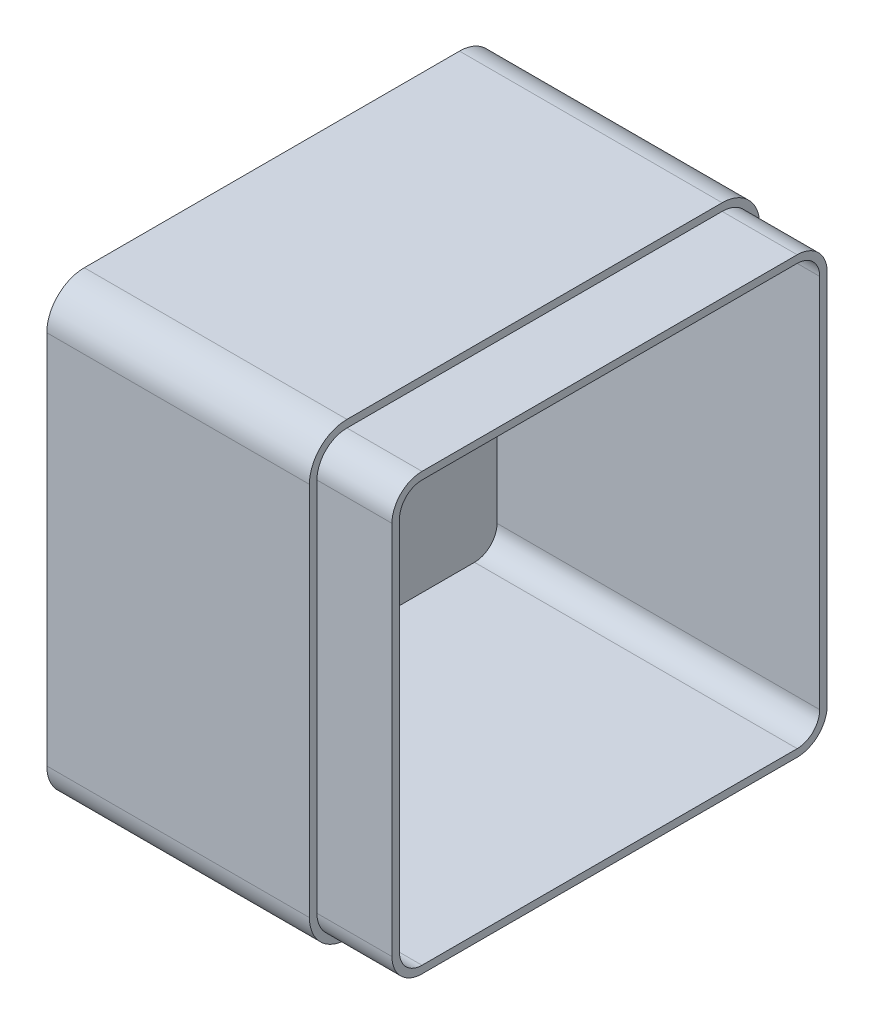
ISO-10303-21;
HEADER;
FILE_DESCRIPTION(('STEP AP214'),'2;1');
FILE_NAME('part.step','',(''),(''),'','','');
FILE_SCHEMA(('AUTOMOTIVE_DESIGN { 1 0 10303 214 1 1 1 1 }'));
ENDSEC;
DATA;
#1=APPLICATION_CONTEXT('core data for automotive mechanical design processes');
#2=APPLICATION_PROTOCOL_DEFINITION('international standard','automotive_design',2000,#1);
#3=PRODUCT_CONTEXT('',#1,'mechanical');
#4=PRODUCT('Part','Part','',(#3));
#5=PRODUCT_RELATED_PRODUCT_CATEGORY('part','',(#4));
#6=PRODUCT_DEFINITION_FORMATION('','',#4);
#7=PRODUCT_DEFINITION_CONTEXT('part definition',#1,'design');
#8=PRODUCT_DEFINITION('design','',#6,#7);
#9=PRODUCT_DEFINITION_SHAPE('','',#8);
#10=(LENGTH_UNIT() NAMED_UNIT(*) SI_UNIT(.MILLI.,.METRE.));
#11=(NAMED_UNIT(*) PLANE_ANGLE_UNIT() SI_UNIT($,.RADIAN.));
#12=(NAMED_UNIT(*) SI_UNIT($,.STERADIAN.) SOLID_ANGLE_UNIT());
#13=UNCERTAINTY_MEASURE_WITH_UNIT(LENGTH_MEASURE(1.E-05),#10,'distance_accuracy_value','');
#14=(GEOMETRIC_REPRESENTATION_CONTEXT(3) GLOBAL_UNCERTAINTY_ASSIGNED_CONTEXT((#13)) GLOBAL_UNIT_ASSIGNED_CONTEXT((#10,
#11,#12)) REPRESENTATION_CONTEXT('',''));
#15=CARTESIAN_POINT('',(0.,0.,0.));
#16=DIRECTION('',(0.,0.,1.));
#17=DIRECTION('',(1.,0.,0.));
#18=AXIS2_PLACEMENT_3D('',#15,#16,#17);
#19=CARTESIAN_POINT('',(90.,0.,0.));
#20=DIRECTION('',(-1.,0.,0.));
#21=DIRECTION('',(0.,0.,1.));
#22=AXIS2_PLACEMENT_3D('',#19,#20,#21);
#23=PLANE('',#22);
#24=DIRECTION('',(0.,1.,0.));
#25=VECTOR('',#24,1.);
#26=CARTESIAN_POINT('',(90.,0.,4.));
#27=LINE('',#26,#25);
#28=CARTESIAN_POINT('',(90.,9.99999999999999,4.));
#29=VERTEX_POINT('',#28);
#30=CARTESIAN_POINT('',(90.,110.,4.));
#31=VERTEX_POINT('',#30);
#32=EDGE_CURVE('E345',#29,#31,#27,.T.);
#33=ORIENTED_EDGE('',*,*,#32,.F.);
#34=CARTESIAN_POINT('',(90.,9.99999999999999,10.));
#35=DIRECTION('',(-1.,0.,0.));
#36=DIRECTION('',(0.,0.,1.));
#37=AXIS2_PLACEMENT_3D('',#34,#35,#36);
#38=CIRCLE('',#37,6.);
#39=CARTESIAN_POINT('',(90.,4.,10.));
#40=VERTEX_POINT('',#39);
#41=EDGE_CURVE('E346',#40,#29,#38,.F.);
#42=ORIENTED_EDGE('',*,*,#41,.F.);
#43=DIRECTION('',(0.,0.,-1.));
#44=VECTOR('',#43,1.);
#45=CARTESIAN_POINT('',(90.,4.,0.));
#46=LINE('',#45,#44);
#47=CARTESIAN_POINT('',(90.,3.99999999999996,110.));
#48=VERTEX_POINT('',#47);
#49=EDGE_CURVE('E326',#48,#40,#46,.T.);
#50=ORIENTED_EDGE('',*,*,#49,.F.);
#51=CARTESIAN_POINT('',(90.,9.99999999999996,110.));
#52=DIRECTION('',(-1.,0.,0.));
#53=DIRECTION('',(0.,0.,1.));
#54=AXIS2_PLACEMENT_3D('',#51,#52,#53);
#55=CIRCLE('',#54,6.);
#56=CARTESIAN_POINT('',(90.,9.99999999999996,116.));
#57=VERTEX_POINT('',#56);
#58=EDGE_CURVE('E348',#57,#48,#55,.F.);
#59=ORIENTED_EDGE('',*,*,#58,.F.);
#60=DIRECTION('',(0.,-1.,0.));
#61=VECTOR('',#60,1.);
#62=CARTESIAN_POINT('',(90.,0.,116.));
#63=LINE('',#62,#61);
#64=CARTESIAN_POINT('',(90.,110.,116.));
#65=VERTEX_POINT('',#64);
#66=EDGE_CURVE('E338',#65,#57,#63,.T.);
#67=ORIENTED_EDGE('',*,*,#66,.F.);
#68=CARTESIAN_POINT('',(90.,110.,110.));
#69=DIRECTION('',(-1.,0.,0.));
#70=DIRECTION('',(0.,0.,1.));
#71=AXIS2_PLACEMENT_3D('',#68,#69,#70);
#72=CIRCLE('',#71,6.);
#73=CARTESIAN_POINT('',(90.,116.,110.));
#74=VERTEX_POINT('',#73);
#75=EDGE_CURVE('E331',#74,#65,#72,.F.);
#76=ORIENTED_EDGE('',*,*,#75,.F.);
#77=DIRECTION('',(0.,0.,1.));
#78=VECTOR('',#77,1.);
#79=CARTESIAN_POINT('',(90.,116.,0.));
#80=LINE('',#79,#78);
#81=CARTESIAN_POINT('',(90.,116.,10.));
#82=VERTEX_POINT('',#81);
#83=EDGE_CURVE('E351',#82,#74,#80,.T.);
#84=ORIENTED_EDGE('',*,*,#83,.F.);
#85=CARTESIAN_POINT('',(90.,110.,10.));
#86=DIRECTION('',(-1.,0.,0.));
#87=DIRECTION('',(0.,0.,1.));
#88=AXIS2_PLACEMENT_3D('',#85,#86,#87);
#89=CIRCLE('',#88,6.);
#90=EDGE_CURVE('E309',#31,#82,#89,.F.);
#91=ORIENTED_EDGE('',*,*,#90,.F.);
#92=EDGE_LOOP('',(#33,#42,#50,#59,#67,#76,#84,#91));
#93=FACE_BOUND('',#92,.T.);
#94=CARTESIAN_POINT('',(90.,9.99999999999999,10.));
#95=DIRECTION('',(1.,0.,0.));
#96=DIRECTION('',(0.,0.,-1.));
#97=AXIS2_PLACEMENT_3D('',#94,#95,#96);
#98=CIRCLE('',#97,8.00000000000001);
#99=CARTESIAN_POINT('',(90.,1.99999999999996,9.99999999999999));
#100=VERTEX_POINT('',#99);
#101=CARTESIAN_POINT('',(90.,9.99999999999999,2.));
#102=VERTEX_POINT('',#101);
#103=EDGE_CURVE('E256',#100,#102,#98,.T.);
#104=ORIENTED_EDGE('',*,*,#103,.T.);
#105=DIRECTION('',(0.,1.,0.));
#106=VECTOR('',#105,1.);
#107=CARTESIAN_POINT('',(90.,9.99999999999999,2.));
#108=LINE('',#107,#106);
#109=CARTESIAN_POINT('',(90.,110.,2.));
#110=VERTEX_POINT('',#109);
#111=EDGE_CURVE('E216',#102,#110,#108,.T.);
#112=ORIENTED_EDGE('',*,*,#111,.T.);
#113=CARTESIAN_POINT('',(90.,110.,10.));
#114=DIRECTION('',(1.,0.,0.));
#115=DIRECTION('',(0.,0.,-1.));
#116=AXIS2_PLACEMENT_3D('',#113,#114,#115);
#117=CIRCLE('',#116,7.99999999999999);
#118=CARTESIAN_POINT('',(90.,118.,9.99999999999999));
#119=VERTEX_POINT('',#118);
#120=EDGE_CURVE('E64',#110,#119,#117,.T.);
#121=ORIENTED_EDGE('',*,*,#120,.T.);
#122=DIRECTION('',(0.,0.,1.));
#123=VECTOR('',#122,1.);
#124=CARTESIAN_POINT('',(90.,118.,9.99999999999999));
#125=LINE('',#124,#123);
#126=CARTESIAN_POINT('',(90.,118.,110.));
#127=VERTEX_POINT('',#126);
#128=EDGE_CURVE('E260',#119,#127,#125,.T.);
#129=ORIENTED_EDGE('',*,*,#128,.T.);
#130=CARTESIAN_POINT('',(90.,110.,110.));
#131=DIRECTION('',(1.,0.,0.));
#132=DIRECTION('',(0.,0.,-1.));
#133=AXIS2_PLACEMENT_3D('',#130,#131,#132);
#134=CIRCLE('',#133,8.00000000000001);
#135=CARTESIAN_POINT('',(90.,110.,118.));
#136=VERTEX_POINT('',#135);
#137=EDGE_CURVE('E263',#127,#136,#134,.T.);
#138=ORIENTED_EDGE('',*,*,#137,.T.);
#139=DIRECTION('',(0.,-1.,0.));
#140=VECTOR('',#139,1.);
#141=CARTESIAN_POINT('',(90.,110.,118.));
#142=LINE('',#141,#140);
#143=CARTESIAN_POINT('',(90.,9.99999999999995,118.));
#144=VERTEX_POINT('',#143);
#145=EDGE_CURVE('E266',#136,#144,#142,.T.);
#146=ORIENTED_EDGE('',*,*,#145,.T.);
#147=CARTESIAN_POINT('',(90.,9.99999999999996,110.));
#148=DIRECTION('',(1.,0.,0.));
#149=DIRECTION('',(0.,0.,-1.));
#150=AXIS2_PLACEMENT_3D('',#147,#148,#149);
#151=CIRCLE('',#150,7.99999999999999);
#152=CARTESIAN_POINT('',(90.,1.99999999999997,110.));
#153=VERTEX_POINT('',#152);
#154=EDGE_CURVE('E239',#144,#153,#151,.T.);
#155=ORIENTED_EDGE('',*,*,#154,.T.);
#156=DIRECTION('',(0.,0.,-1.));
#157=VECTOR('',#156,1.);
#158=CARTESIAN_POINT('',(90.,1.99999999999996,110.));
#159=LINE('',#158,#157);
#160=EDGE_CURVE('E236',#153,#100,#159,.T.);
#161=ORIENTED_EDGE('',*,*,#160,.T.);
#162=EDGE_LOOP('',(#104,#112,#121,#129,#138,#146,#155,#161));
#163=FACE_BOUND('',#162,.T.);
#164=ADVANCED_FACE('F49',(#93,#163),#23,.F.);
#165=CARTESIAN_POINT('',(90.,4.,0.));
#166=DIRECTION('',(0.,1.,0.));
#167=DIRECTION('',(0.,0.,1.));
#168=AXIS2_PLACEMENT_3D('',#165,#166,#167);
#169=PLANE('',#168);
#170=DIRECTION('',(0.,0.,-1.));
#171=VECTOR('',#170,1.);
#172=CARTESIAN_POINT('',(4.,4.,0.));
#173=LINE('',#172,#171);
#174=CARTESIAN_POINT('',(4.,3.99999999999996,110.));
#175=VERTEX_POINT('',#174);
#176=CARTESIAN_POINT('',(4.,4.,10.));
#177=VERTEX_POINT('',#176);
#178=EDGE_CURVE('E298',#175,#177,#173,.T.);
#179=ORIENTED_EDGE('',*,*,#178,.F.);
#180=DIRECTION('',(1.,0.,0.));
#181=VECTOR('',#180,1.);
#182=CARTESIAN_POINT('',(90.,3.99999999999996,110.));
#183=LINE('',#182,#181);
#184=EDGE_CURVE('E306',#48,#175,#183,.F.);
#185=ORIENTED_EDGE('',*,*,#184,.F.);
#186=ORIENTED_EDGE('',*,*,#49,.T.);
#187=DIRECTION('',(1.,0.,0.));
#188=VECTOR('',#187,1.);
#189=CARTESIAN_POINT('',(90.,4.,10.));
#190=LINE('',#189,#188);
#191=EDGE_CURVE('E302',#177,#40,#190,.T.);
#192=ORIENTED_EDGE('',*,*,#191,.F.);
#193=EDGE_LOOP('',(#179,#185,#186,#192));
#194=FACE_BOUND('',#193,.T.);
#195=ADVANCED_FACE('F442',(#194),#169,.T.);
#196=CARTESIAN_POINT('',(90.,0.,4.));
#197=DIRECTION('',(0.,0.,1.));
#198=DIRECTION('',(1.,0.,0.));
#199=AXIS2_PLACEMENT_3D('',#196,#197,#198);
#200=PLANE('',#199);
#201=DIRECTION('',(0.,1.,0.));
#202=VECTOR('',#201,1.);
#203=CARTESIAN_POINT('',(4.,0.,4.));
#204=LINE('',#203,#202);
#205=CARTESIAN_POINT('',(4.,9.99999999999999,4.));
#206=VERTEX_POINT('',#205);
#207=CARTESIAN_POINT('',(4.,110.,4.));
#208=VERTEX_POINT('',#207);
#209=EDGE_CURVE('E301',#206,#208,#204,.T.);
#210=ORIENTED_EDGE('',*,*,#209,.F.);
#211=DIRECTION('',(1.,0.,0.));
#212=VECTOR('',#211,1.);
#213=CARTESIAN_POINT('',(90.,9.99999999999999,4.));
#214=LINE('',#213,#212);
#215=EDGE_CURVE('E316',#29,#206,#214,.F.);
#216=ORIENTED_EDGE('',*,*,#215,.F.);
#217=ORIENTED_EDGE('',*,*,#32,.T.);
#218=DIRECTION('',(1.,0.,0.));
#219=VECTOR('',#218,1.);
#220=CARTESIAN_POINT('',(90.,110.,4.));
#221=LINE('',#220,#219);
#222=EDGE_CURVE('E329',#208,#31,#221,.T.);
#223=ORIENTED_EDGE('',*,*,#222,.F.);
#224=EDGE_LOOP('',(#210,#216,#217,#223));
#225=FACE_BOUND('',#224,.T.);
#226=ADVANCED_FACE('F450',(#225),#200,.T.);
#227=CARTESIAN_POINT('',(90.,116.,0.));
#228=DIRECTION('',(0.,-1.,0.));
#229=DIRECTION('',(0.,0.,-1.));
#230=AXIS2_PLACEMENT_3D('',#227,#228,#229);
#231=PLANE('',#230);
#232=ORIENTED_EDGE('',*,*,#83,.T.);
#233=DIRECTION('',(1.,0.,0.));
#234=VECTOR('',#233,1.);
#235=CARTESIAN_POINT('',(90.,116.,110.));
#236=LINE('',#235,#234);
#237=CARTESIAN_POINT('',(4.,116.,110.));
#238=VERTEX_POINT('',#237);
#239=EDGE_CURVE('E336',#238,#74,#236,.T.);
#240=ORIENTED_EDGE('',*,*,#239,.F.);
#241=DIRECTION('',(0.,0.,1.));
#242=VECTOR('',#241,1.);
#243=CARTESIAN_POINT('',(4.,116.,0.));
#244=LINE('',#243,#242);
#245=CARTESIAN_POINT('',(4.,116.,10.));
#246=VERTEX_POINT('',#245);
#247=EDGE_CURVE('E310',#246,#238,#244,.T.);
#248=ORIENTED_EDGE('',*,*,#247,.F.);
#249=DIRECTION('',(1.,0.,0.));
#250=VECTOR('',#249,1.);
#251=CARTESIAN_POINT('',(90.,116.,10.));
#252=LINE('',#251,#250);
#253=EDGE_CURVE('E328',#82,#246,#252,.F.);
#254=ORIENTED_EDGE('',*,*,#253,.F.);
#255=EDGE_LOOP('',(#232,#240,#248,#254));
#256=FACE_BOUND('',#255,.T.);
#257=ADVANCED_FACE('F569',(#256),#231,.T.);
#258=CARTESIAN_POINT('',(90.,0.,116.));
#259=DIRECTION('',(0.,0.,-1.));
#260=DIRECTION('',(-1.,0.,0.));
#261=AXIS2_PLACEMENT_3D('',#258,#259,#260);
#262=PLANE('',#261);
#263=DIRECTION('',(0.,-1.,0.));
#264=VECTOR('',#263,1.);
#265=CARTESIAN_POINT('',(4.,0.,116.));
#266=LINE('',#265,#264);
#267=CARTESIAN_POINT('',(4.,110.,116.));
#268=VERTEX_POINT('',#267);
#269=CARTESIAN_POINT('',(4.,9.99999999999996,116.));
#270=VERTEX_POINT('',#269);
#271=EDGE_CURVE('E313',#268,#270,#266,.T.);
#272=ORIENTED_EDGE('',*,*,#271,.F.);
#273=DIRECTION('',(-1.,0.,0.));
#274=VECTOR('',#273,1.);
#275=CARTESIAN_POINT('',(90.,110.,116.));
#276=LINE('',#275,#274);
#277=EDGE_CURVE('E305',#65,#268,#276,.T.);
#278=ORIENTED_EDGE('',*,*,#277,.F.);
#279=ORIENTED_EDGE('',*,*,#66,.T.);
#280=DIRECTION('',(-1.,0.,0.));
#281=VECTOR('',#280,1.);
#282=CARTESIAN_POINT('',(90.,9.99999999999996,116.));
#283=LINE('',#282,#281);
#284=EDGE_CURVE('E341',#270,#57,#283,.F.);
#285=ORIENTED_EDGE('',*,*,#284,.F.);
#286=EDGE_LOOP('',(#272,#278,#279,#285));
#287=FACE_BOUND('',#286,.T.);
#288=ADVANCED_FACE('F573',(#287),#262,.T.);
#289=CARTESIAN_POINT('',(4.,0.,0.));
#290=DIRECTION('',(-1.,0.,0.));
#291=DIRECTION('',(0.,0.,1.));
#292=AXIS2_PLACEMENT_3D('',#289,#290,#291);
#293=PLANE('',#292);
#294=ORIENTED_EDGE('',*,*,#247,.T.);
#295=CARTESIAN_POINT('',(4.,110.,110.));
#296=DIRECTION('',(-1.,0.,0.));
#297=DIRECTION('',(0.,0.,1.));
#298=AXIS2_PLACEMENT_3D('',#295,#296,#297);
#299=CIRCLE('',#298,6.);
#300=EDGE_CURVE('E323',#268,#238,#299,.T.);
#301=ORIENTED_EDGE('',*,*,#300,.F.);
#302=ORIENTED_EDGE('',*,*,#271,.T.);
#303=CARTESIAN_POINT('',(4.,9.99999999999996,110.));
#304=DIRECTION('',(-1.,0.,0.));
#305=DIRECTION('',(0.,0.,1.));
#306=AXIS2_PLACEMENT_3D('',#303,#304,#305);
#307=CIRCLE('',#306,6.);
#308=EDGE_CURVE('E321',#175,#270,#307,.T.);
#309=ORIENTED_EDGE('',*,*,#308,.F.);
#310=ORIENTED_EDGE('',*,*,#178,.T.);
#311=CARTESIAN_POINT('',(4.,9.99999999999999,10.));
#312=DIRECTION('',(-1.,0.,0.));
#313=DIRECTION('',(0.,0.,1.));
#314=AXIS2_PLACEMENT_3D('',#311,#312,#313);
#315=CIRCLE('',#314,6.);
#316=EDGE_CURVE('E317',#206,#177,#315,.T.);
#317=ORIENTED_EDGE('',*,*,#316,.F.);
#318=ORIENTED_EDGE('',*,*,#209,.T.);
#319=CARTESIAN_POINT('',(4.,110.,10.));
#320=DIRECTION('',(-1.,0.,0.));
#321=DIRECTION('',(0.,0.,1.));
#322=AXIS2_PLACEMENT_3D('',#319,#320,#321);
#323=CIRCLE('',#322,6.);
#324=EDGE_CURVE('E314',#246,#208,#323,.T.);
#325=ORIENTED_EDGE('',*,*,#324,.F.);
#326=EDGE_LOOP('',(#294,#301,#302,#309,#310,#317,#318,#325));
#327=FACE_BOUND('',#326,.T.);
#328=ADVANCED_FACE('F577',(#327),#293,.F.);
#329=CARTESIAN_POINT('',(90.,110.,10.));
#330=DIRECTION('',(-1.,0.,0.));
#331=DIRECTION('',(0.,0.,1.));
#332=AXIS2_PLACEMENT_3D('',#329,#330,#331);
#333=CYLINDRICAL_SURFACE('',#332,6.);
#334=ORIENTED_EDGE('',*,*,#90,.T.);
#335=ORIENTED_EDGE('',*,*,#253,.T.);
#336=ORIENTED_EDGE('',*,*,#324,.T.);
#337=ORIENTED_EDGE('',*,*,#222,.T.);
#338=EDGE_LOOP('',(#334,#335,#336,#337));
#339=FACE_BOUND('',#338,.T.);
#340=ADVANCED_FACE('F581',(#339),#333,.F.);
#341=CARTESIAN_POINT('',(90.,9.99999999999999,10.));
#342=DIRECTION('',(-1.,0.,0.));
#343=DIRECTION('',(0.,0.,1.));
#344=AXIS2_PLACEMENT_3D('',#341,#342,#343);
#345=CYLINDRICAL_SURFACE('',#344,6.);
#346=ORIENTED_EDGE('',*,*,#41,.T.);
#347=ORIENTED_EDGE('',*,*,#215,.T.);
#348=ORIENTED_EDGE('',*,*,#316,.T.);
#349=ORIENTED_EDGE('',*,*,#191,.T.);
#350=EDGE_LOOP('',(#346,#347,#348,#349));
#351=FACE_BOUND('',#350,.T.);
#352=ADVANCED_FACE('F585',(#351),#345,.F.);
#353=CARTESIAN_POINT('',(90.,9.99999999999996,110.));
#354=DIRECTION('',(-1.,0.,0.));
#355=DIRECTION('',(0.,0.,1.));
#356=AXIS2_PLACEMENT_3D('',#353,#354,#355);
#357=CYLINDRICAL_SURFACE('',#356,6.);
#358=ORIENTED_EDGE('',*,*,#58,.T.);
#359=ORIENTED_EDGE('',*,*,#184,.T.);
#360=ORIENTED_EDGE('',*,*,#308,.T.);
#361=ORIENTED_EDGE('',*,*,#284,.T.);
#362=EDGE_LOOP('',(#358,#359,#360,#361));
#363=FACE_BOUND('',#362,.T.);
#364=ADVANCED_FACE('F588',(#363),#357,.F.);
#365=CARTESIAN_POINT('',(90.,110.,110.));
#366=DIRECTION('',(-1.,0.,0.));
#367=DIRECTION('',(0.,0.,1.));
#368=AXIS2_PLACEMENT_3D('',#365,#366,#367);
#369=CYLINDRICAL_SURFACE('',#368,6.);
#370=ORIENTED_EDGE('',*,*,#75,.T.);
#371=ORIENTED_EDGE('',*,*,#277,.T.);
#372=ORIENTED_EDGE('',*,*,#300,.T.);
#373=ORIENTED_EDGE('',*,*,#239,.T.);
#374=EDGE_LOOP('',(#370,#371,#372,#373));
#375=FACE_BOUND('',#374,.T.);
#376=ADVANCED_FACE('F457',(#375),#369,.F.);
#377=CARTESIAN_POINT('',(70.,9.99999999999999,10.));
#378=DIRECTION('',(1.,0.,0.));
#379=DIRECTION('',(0.,0.,-1.));
#380=AXIS2_PLACEMENT_3D('',#377,#378,#379);
#381=PLANE('',#380);
#382=DIRECTION('',(0.,0.,-1.));
#383=VECTOR('',#382,1.);
#384=CARTESIAN_POINT('',(70.,1.99999999999996,110.));
#385=LINE('',#384,#383);
#386=CARTESIAN_POINT('',(70.,1.99999999999997,110.));
#387=VERTEX_POINT('',#386);
#388=CARTESIAN_POINT('',(70.,1.99999999999996,9.99999999999999));
#389=VERTEX_POINT('',#388);
#390=EDGE_CURVE('E222',#387,#389,#385,.T.);
#391=ORIENTED_EDGE('',*,*,#390,.F.);
#392=CARTESIAN_POINT('',(70.,9.99999999999996,110.));
#393=DIRECTION('',(1.,0.,0.));
#394=DIRECTION('',(0.,0.,-1.));
#395=AXIS2_PLACEMENT_3D('',#392,#393,#394);
#396=CIRCLE('',#395,7.99999999999999);
#397=CARTESIAN_POINT('',(70.,9.99999999999995,118.));
#398=VERTEX_POINT('',#397);
#399=EDGE_CURVE('E252',#398,#387,#396,.T.);
#400=ORIENTED_EDGE('',*,*,#399,.F.);
#401=DIRECTION('',(0.,-1.,0.));
#402=VECTOR('',#401,1.);
#403=CARTESIAN_POINT('',(70.,110.,118.));
#404=LINE('',#403,#402);
#405=CARTESIAN_POINT('',(70.,110.,118.));
#406=VERTEX_POINT('',#405);
#407=EDGE_CURVE('E249',#406,#398,#404,.T.);
#408=ORIENTED_EDGE('',*,*,#407,.F.);
#409=CARTESIAN_POINT('',(70.,110.,110.));
#410=DIRECTION('',(1.,0.,0.));
#411=DIRECTION('',(0.,0.,-1.));
#412=AXIS2_PLACEMENT_3D('',#409,#410,#411);
#413=CIRCLE('',#412,8.00000000000001);
#414=CARTESIAN_POINT('',(70.,118.,110.));
#415=VERTEX_POINT('',#414);
#416=EDGE_CURVE('E246',#415,#406,#413,.T.);
#417=ORIENTED_EDGE('',*,*,#416,.F.);
#418=DIRECTION('',(0.,0.,1.));
#419=VECTOR('',#418,1.);
#420=CARTESIAN_POINT('',(70.,118.,9.99999999999999));
#421=LINE('',#420,#419);
#422=CARTESIAN_POINT('',(70.,118.,9.99999999999999));
#423=VERTEX_POINT('',#422);
#424=EDGE_CURVE('E243',#423,#415,#421,.T.);
#425=ORIENTED_EDGE('',*,*,#424,.F.);
#426=CARTESIAN_POINT('',(70.,110.,10.));
#427=DIRECTION('',(1.,0.,0.));
#428=DIRECTION('',(0.,0.,-1.));
#429=AXIS2_PLACEMENT_3D('',#426,#427,#428);
#430=CIRCLE('',#429,7.99999999999999);
#431=CARTESIAN_POINT('',(70.,110.,2.));
#432=VERTEX_POINT('',#431);
#433=EDGE_CURVE('E232',#432,#423,#430,.T.);
#434=ORIENTED_EDGE('',*,*,#433,.F.);
#435=DIRECTION('',(0.,1.,0.));
#436=VECTOR('',#435,1.);
#437=CARTESIAN_POINT('',(70.,9.99999999999999,2.));
#438=LINE('',#437,#436);
#439=CARTESIAN_POINT('',(70.,9.99999999999999,2.));
#440=VERTEX_POINT('',#439);
#441=EDGE_CURVE('E214',#440,#432,#438,.T.);
#442=ORIENTED_EDGE('',*,*,#441,.F.);
#443=CARTESIAN_POINT('',(70.,9.99999999999999,10.));
#444=DIRECTION('',(1.,0.,0.));
#445=DIRECTION('',(0.,0.,-1.));
#446=AXIS2_PLACEMENT_3D('',#443,#444,#445);
#447=CIRCLE('',#446,8.00000000000001);
#448=EDGE_CURVE('E228',#389,#440,#447,.T.);
#449=ORIENTED_EDGE('',*,*,#448,.F.);
#450=EDGE_LOOP('',(#391,#400,#408,#417,#425,#434,#442,#449));
#451=FACE_BOUND('',#450,.T.);
#452=CARTESIAN_POINT('',(70.,9.99999999999999,10.));
#453=DIRECTION('',(1.,0.,0.));
#454=DIRECTION('',(0.,0.,-1.));
#455=AXIS2_PLACEMENT_3D('',#452,#453,#454);
#456=CIRCLE('',#455,10.);
#457=CARTESIAN_POINT('',(70.,0.,9.99999999999999));
#458=VERTEX_POINT('',#457);
#459=CARTESIAN_POINT('',(70.,9.99999999999999,0.));
#460=VERTEX_POINT('',#459);
#461=EDGE_CURVE('E272',#458,#460,#456,.T.);
#462=ORIENTED_EDGE('',*,*,#461,.T.);
#463=DIRECTION('',(0.,1.,0.));
#464=VECTOR('',#463,1.);
#465=CARTESIAN_POINT('',(70.,9.99999999999999,0.));
#466=LINE('',#465,#464);
#467=CARTESIAN_POINT('',(70.,110.,0.));
#468=VERTEX_POINT('',#467);
#469=EDGE_CURVE('E285',#460,#468,#466,.T.);
#470=ORIENTED_EDGE('',*,*,#469,.T.);
#471=CARTESIAN_POINT('',(70.,110.,10.));
#472=DIRECTION('',(1.,0.,0.));
#473=DIRECTION('',(0.,0.,-1.));
#474=AXIS2_PLACEMENT_3D('',#471,#472,#473);
#475=CIRCLE('',#474,9.99999999999999);
#476=CARTESIAN_POINT('',(70.,120.,10.));
#477=VERTEX_POINT('',#476);
#478=EDGE_CURVE('E287',#468,#477,#475,.T.);
#479=ORIENTED_EDGE('',*,*,#478,.T.);
#480=DIRECTION('',(0.,0.,1.));
#481=VECTOR('',#480,1.);
#482=CARTESIAN_POINT('',(70.,120.,10.));
#483=LINE('',#482,#481);
#484=CARTESIAN_POINT('',(70.,120.,110.));
#485=VERTEX_POINT('',#484);
#486=EDGE_CURVE('E72',#477,#485,#483,.T.);
#487=ORIENTED_EDGE('',*,*,#486,.T.);
#488=CARTESIAN_POINT('',(70.,110.,110.));
#489=DIRECTION('',(1.,0.,0.));
#490=DIRECTION('',(0.,0.,-1.));
#491=AXIS2_PLACEMENT_3D('',#488,#489,#490);
#492=CIRCLE('',#491,9.99999999999999);
#493=CARTESIAN_POINT('',(70.,110.,120.));
#494=VERTEX_POINT('',#493);
#495=EDGE_CURVE('E290',#485,#494,#492,.T.);
#496=ORIENTED_EDGE('',*,*,#495,.T.);
#497=DIRECTION('',(0.,-1.,0.));
#498=VECTOR('',#497,1.);
#499=CARTESIAN_POINT('',(70.,110.,120.));
#500=LINE('',#499,#498);
#501=CARTESIAN_POINT('',(70.,9.99999999999996,120.));
#502=VERTEX_POINT('',#501);
#503=EDGE_CURVE('E292',#494,#502,#500,.T.);
#504=ORIENTED_EDGE('',*,*,#503,.T.);
#505=CARTESIAN_POINT('',(70.,9.99999999999996,110.));
#506=DIRECTION('',(1.,0.,0.));
#507=DIRECTION('',(0.,0.,-1.));
#508=AXIS2_PLACEMENT_3D('',#505,#506,#507);
#509=CIRCLE('',#508,9.99999999999999);
#510=CARTESIAN_POINT('',(70.,0.,110.));
#511=VERTEX_POINT('',#510);
#512=EDGE_CURVE('E294',#502,#511,#509,.T.);
#513=ORIENTED_EDGE('',*,*,#512,.T.);
#514=DIRECTION('',(0.,0.,-1.));
#515=VECTOR('',#514,1.);
#516=CARTESIAN_POINT('',(70.,0.,110.));
#517=LINE('',#516,#515);
#518=EDGE_CURVE('E296',#511,#458,#517,.T.);
#519=ORIENTED_EDGE('',*,*,#518,.T.);
#520=EDGE_LOOP('',(#462,#470,#479,#487,#496,#504,#513,#519));
#521=FACE_BOUND('',#520,.T.);
#522=ADVANCED_FACE('F227',(#451,#521),#381,.T.);
#523=CARTESIAN_POINT('',(70.,9.99999999999999,10.));
#524=DIRECTION('',(1.,0.,0.));
#525=DIRECTION('',(0.,0.,-1.));
#526=AXIS2_PLACEMENT_3D('',#523,#524,#525);
#527=CYLINDRICAL_SURFACE('',#526,8.00000000000001);
#528=ORIENTED_EDGE('',*,*,#103,.F.);
#529=DIRECTION('',(1.,0.,0.));
#530=VECTOR('',#529,1.);
#531=CARTESIAN_POINT('',(70.,1.99999999999996,9.99999999999999));
#532=LINE('',#531,#530);
#533=EDGE_CURVE('E235',#389,#100,#532,.T.);
#534=ORIENTED_EDGE('',*,*,#533,.F.);
#535=ORIENTED_EDGE('',*,*,#448,.T.);
#536=DIRECTION('',(1.,0.,0.));
#537=VECTOR('',#536,1.);
#538=CARTESIAN_POINT('',(70.,9.99999999999999,2.));
#539=LINE('',#538,#537);
#540=EDGE_CURVE('E211',#440,#102,#539,.T.);
#541=ORIENTED_EDGE('',*,*,#540,.T.);
#542=EDGE_LOOP('',(#528,#534,#535,#541));
#543=FACE_BOUND('',#542,.T.);
#544=ADVANCED_FACE('F234',(#543),#527,.T.);
#545=CARTESIAN_POINT('',(70.,1.99999999999996,110.));
#546=DIRECTION('',(0.,-1.,0.));
#547=DIRECTION('',(0.,0.,-1.));
#548=AXIS2_PLACEMENT_3D('',#545,#546,#547);
#549=PLANE('',#548);
#550=ORIENTED_EDGE('',*,*,#160,.F.);
#551=DIRECTION('',(1.,0.,0.));
#552=VECTOR('',#551,1.);
#553=CARTESIAN_POINT('',(70.,1.99999999999997,110.));
#554=LINE('',#553,#552);
#555=EDGE_CURVE('E273',#387,#153,#554,.T.);
#556=ORIENTED_EDGE('',*,*,#555,.F.);
#557=ORIENTED_EDGE('',*,*,#390,.T.);
#558=ORIENTED_EDGE('',*,*,#533,.T.);
#559=EDGE_LOOP('',(#550,#556,#557,#558));
#560=FACE_BOUND('',#559,.T.);
#561=ADVANCED_FACE('F496',(#560),#549,.T.);
#562=CARTESIAN_POINT('',(70.,9.99999999999996,110.));
#563=DIRECTION('',(1.,0.,0.));
#564=DIRECTION('',(0.,0.,-1.));
#565=AXIS2_PLACEMENT_3D('',#562,#563,#564);
#566=CYLINDRICAL_SURFACE('',#565,7.99999999999999);
#567=ORIENTED_EDGE('',*,*,#154,.F.);
#568=DIRECTION('',(1.,0.,0.));
#569=VECTOR('',#568,1.);
#570=CARTESIAN_POINT('',(70.,9.99999999999995,118.));
#571=LINE('',#570,#569);
#572=EDGE_CURVE('E275',#398,#144,#571,.T.);
#573=ORIENTED_EDGE('',*,*,#572,.F.);
#574=ORIENTED_EDGE('',*,*,#399,.T.);
#575=ORIENTED_EDGE('',*,*,#555,.T.);
#576=EDGE_LOOP('',(#567,#573,#574,#575));
#577=FACE_BOUND('',#576,.T.);
#578=ADVANCED_FACE('F504',(#577),#566,.T.);
#579=CARTESIAN_POINT('',(70.,110.,118.));
#580=DIRECTION('',(0.,0.,1.));
#581=DIRECTION('',(1.,0.,0.));
#582=AXIS2_PLACEMENT_3D('',#579,#580,#581);
#583=PLANE('',#582);
#584=ORIENTED_EDGE('',*,*,#145,.F.);
#585=DIRECTION('',(1.,0.,0.));
#586=VECTOR('',#585,1.);
#587=CARTESIAN_POINT('',(70.,110.,118.));
#588=LINE('',#587,#586);
#589=EDGE_CURVE('E277',#406,#136,#588,.T.);
#590=ORIENTED_EDGE('',*,*,#589,.F.);
#591=ORIENTED_EDGE('',*,*,#407,.T.);
#592=ORIENTED_EDGE('',*,*,#572,.T.);
#593=EDGE_LOOP('',(#584,#590,#591,#592));
#594=FACE_BOUND('',#593,.T.);
#595=ADVANCED_FACE('F513',(#594),#583,.T.);
#596=CARTESIAN_POINT('',(70.,110.,110.));
#597=DIRECTION('',(1.,0.,0.));
#598=DIRECTION('',(0.,0.,-1.));
#599=AXIS2_PLACEMENT_3D('',#596,#597,#598);
#600=CYLINDRICAL_SURFACE('',#599,8.00000000000001);
#601=ORIENTED_EDGE('',*,*,#137,.F.);
#602=DIRECTION('',(1.,0.,0.));
#603=VECTOR('',#602,1.);
#604=CARTESIAN_POINT('',(70.,118.,110.));
#605=LINE('',#604,#603);
#606=EDGE_CURVE('E279',#415,#127,#605,.T.);
#607=ORIENTED_EDGE('',*,*,#606,.F.);
#608=ORIENTED_EDGE('',*,*,#416,.T.);
#609=ORIENTED_EDGE('',*,*,#589,.T.);
#610=EDGE_LOOP('',(#601,#607,#608,#609));
#611=FACE_BOUND('',#610,.T.);
#612=ADVANCED_FACE('F522',(#611),#600,.T.);
#613=CARTESIAN_POINT('',(70.,118.,9.99999999999999));
#614=DIRECTION('',(0.,1.,0.));
#615=DIRECTION('',(0.,0.,1.));
#616=AXIS2_PLACEMENT_3D('',#613,#614,#615);
#617=PLANE('',#616);
#618=ORIENTED_EDGE('',*,*,#128,.F.);
#619=DIRECTION('',(1.,0.,0.));
#620=VECTOR('',#619,1.);
#621=CARTESIAN_POINT('',(70.,118.,9.99999999999999));
#622=LINE('',#621,#620);
#623=EDGE_CURVE('E281',#423,#119,#622,.T.);
#624=ORIENTED_EDGE('',*,*,#623,.F.);
#625=ORIENTED_EDGE('',*,*,#424,.T.);
#626=ORIENTED_EDGE('',*,*,#606,.T.);
#627=EDGE_LOOP('',(#618,#624,#625,#626));
#628=FACE_BOUND('',#627,.T.);
#629=ADVANCED_FACE('F531',(#628),#617,.T.);
#630=CARTESIAN_POINT('',(70.,110.,10.));
#631=DIRECTION('',(1.,0.,0.));
#632=DIRECTION('',(0.,0.,-1.));
#633=AXIS2_PLACEMENT_3D('',#630,#631,#632);
#634=CYLINDRICAL_SURFACE('',#633,7.99999999999999);
#635=ORIENTED_EDGE('',*,*,#120,.F.);
#636=DIRECTION('',(1.,0.,0.));
#637=VECTOR('',#636,1.);
#638=CARTESIAN_POINT('',(70.,110.,2.));
#639=LINE('',#638,#637);
#640=EDGE_CURVE('E221',#432,#110,#639,.T.);
#641=ORIENTED_EDGE('',*,*,#640,.F.);
#642=ORIENTED_EDGE('',*,*,#433,.T.);
#643=ORIENTED_EDGE('',*,*,#623,.T.);
#644=EDGE_LOOP('',(#635,#641,#642,#643));
#645=FACE_BOUND('',#644,.T.);
#646=ADVANCED_FACE('F540',(#645),#634,.T.);
#647=CARTESIAN_POINT('',(70.,9.99999999999999,2.));
#648=DIRECTION('',(0.,0.,-1.));
#649=DIRECTION('',(-1.,0.,0.));
#650=AXIS2_PLACEMENT_3D('',#647,#648,#649);
#651=PLANE('',#650);
#652=ORIENTED_EDGE('',*,*,#111,.F.);
#653=ORIENTED_EDGE('',*,*,#540,.F.);
#654=ORIENTED_EDGE('',*,*,#441,.T.);
#655=ORIENTED_EDGE('',*,*,#640,.T.);
#656=EDGE_LOOP('',(#652,#653,#654,#655));
#657=FACE_BOUND('',#656,.T.);
#658=ADVANCED_FACE('F213',(#657),#651,.T.);
#659=CARTESIAN_POINT('',(0.,0.,0.));
#660=DIRECTION('',(-1.,0.,0.));
#661=DIRECTION('',(0.,0.,1.));
#662=AXIS2_PLACEMENT_3D('',#659,#660,#661);
#663=PLANE('',#662);
#664=DIRECTION('',(0.,0.,1.));
#665=VECTOR('',#664,1.);
#666=CARTESIAN_POINT('',(0.,120.,0.));
#667=LINE('',#666,#665);
#668=CARTESIAN_POINT('',(0.,120.,10.));
#669=VERTEX_POINT('',#668);
#670=CARTESIAN_POINT('',(0.,120.,110.));
#671=VERTEX_POINT('',#670);
#672=EDGE_CURVE('E364',#669,#671,#667,.T.);
#673=ORIENTED_EDGE('',*,*,#672,.F.);
#674=CARTESIAN_POINT('',(0.,110.,10.));
#675=DIRECTION('',(-1.,0.,0.));
#676=DIRECTION('',(0.,0.,1.));
#677=AXIS2_PLACEMENT_3D('',#674,#675,#676);
#678=CIRCLE('',#677,10.);
#679=CARTESIAN_POINT('',(0.,110.,0.));
#680=VERTEX_POINT('',#679);
#681=EDGE_CURVE('E381',#669,#680,#678,.T.);
#682=ORIENTED_EDGE('',*,*,#681,.T.);
#683=DIRECTION('',(0.,1.,0.));
#684=VECTOR('',#683,1.);
#685=CARTESIAN_POINT('',(0.,0.,0.));
#686=LINE('',#685,#684);
#687=CARTESIAN_POINT('',(0.,9.99999999999999,0.));
#688=VERTEX_POINT('',#687);
#689=EDGE_CURVE('E361',#688,#680,#686,.T.);
#690=ORIENTED_EDGE('',*,*,#689,.F.);
#691=CARTESIAN_POINT('',(0.,9.99999999999999,10.));
#692=DIRECTION('',(-1.,0.,0.));
#693=DIRECTION('',(0.,0.,1.));
#694=AXIS2_PLACEMENT_3D('',#691,#692,#693);
#695=CIRCLE('',#694,10.);
#696=CARTESIAN_POINT('',(0.,0.,9.99999999999999));
#697=VERTEX_POINT('',#696);
#698=EDGE_CURVE('E379',#688,#697,#695,.T.);
#699=ORIENTED_EDGE('',*,*,#698,.T.);
#700=DIRECTION('',(0.,0.,-1.));
#701=VECTOR('',#700,1.);
#702=CARTESIAN_POINT('',(0.,0.,0.));
#703=LINE('',#702,#701);
#704=CARTESIAN_POINT('',(0.,0.,110.));
#705=VERTEX_POINT('',#704);
#706=EDGE_CURVE('E343',#705,#697,#703,.T.);
#707=ORIENTED_EDGE('',*,*,#706,.F.);
#708=CARTESIAN_POINT('',(0.,9.99999999999996,110.));
#709=DIRECTION('',(-1.,0.,0.));
#710=DIRECTION('',(0.,0.,1.));
#711=AXIS2_PLACEMENT_3D('',#708,#709,#710);
#712=CIRCLE('',#711,10.);
#713=CARTESIAN_POINT('',(0.,9.99999999999996,120.));
#714=VERTEX_POINT('',#713);
#715=EDGE_CURVE('E377',#705,#714,#712,.T.);
#716=ORIENTED_EDGE('',*,*,#715,.T.);
#717=DIRECTION('',(0.,-1.,0.));
#718=VECTOR('',#717,1.);
#719=CARTESIAN_POINT('',(0.,0.,120.));
#720=LINE('',#719,#718);
#721=CARTESIAN_POINT('',(0.,110.,120.));
#722=VERTEX_POINT('',#721);
#723=EDGE_CURVE('E367',#722,#714,#720,.T.);
#724=ORIENTED_EDGE('',*,*,#723,.F.);
#725=CARTESIAN_POINT('',(0.,110.,110.));
#726=DIRECTION('',(-1.,0.,0.));
#727=DIRECTION('',(0.,0.,1.));
#728=AXIS2_PLACEMENT_3D('',#725,#726,#727);
#729=CIRCLE('',#728,10.);
#730=EDGE_CURVE('E375',#722,#671,#729,.T.);
#731=ORIENTED_EDGE('',*,*,#730,.T.);
#732=EDGE_LOOP('',(#673,#682,#690,#699,#707,#716,#724,#731));
#733=FACE_BOUND('',#732,.T.);
#734=ADVANCED_FACE('F403',(#733),#663,.T.);
#735=CARTESIAN_POINT('',(90.,9.99999999999996,110.));
#736=DIRECTION('',(-1.,0.,0.));
#737=DIRECTION('',(0.,0.,1.));
#738=AXIS2_PLACEMENT_3D('',#735,#736,#737);
#739=CYLINDRICAL_SURFACE('',#738,10.);
#740=DIRECTION('',(-1.,0.,0.));
#741=VECTOR('',#740,1.);
#742=CARTESIAN_POINT('',(90.,0.,110.));
#743=LINE('',#742,#741);
#744=EDGE_CURVE('E388',#511,#705,#743,.T.);
#745=ORIENTED_EDGE('',*,*,#744,.F.);
#746=ORIENTED_EDGE('',*,*,#512,.F.);
#747=DIRECTION('',(-1.,0.,0.));
#748=VECTOR('',#747,1.);
#749=CARTESIAN_POINT('',(90.,9.99999999999996,120.));
#750=LINE('',#749,#748);
#751=EDGE_CURVE('E12',#714,#502,#750,.F.);
#752=ORIENTED_EDGE('',*,*,#751,.F.);
#753=ORIENTED_EDGE('',*,*,#715,.F.);
#754=EDGE_LOOP('',(#745,#746,#752,#753));
#755=FACE_BOUND('',#754,.T.);
#756=ADVANCED_FACE('F408',(#755),#739,.T.);
#757=CARTESIAN_POINT('',(90.,110.,110.));
#758=DIRECTION('',(-1.,0.,0.));
#759=DIRECTION('',(0.,0.,1.));
#760=AXIS2_PLACEMENT_3D('',#757,#758,#759);
#761=CYLINDRICAL_SURFACE('',#760,10.);
#762=DIRECTION('',(-1.,0.,0.));
#763=VECTOR('',#762,1.);
#764=CARTESIAN_POINT('',(90.,110.,120.));
#765=LINE('',#764,#763);
#766=EDGE_CURVE('E57',#494,#722,#765,.T.);
#767=ORIENTED_EDGE('',*,*,#766,.F.);
#768=ORIENTED_EDGE('',*,*,#495,.F.);
#769=DIRECTION('',(-1.,0.,0.));
#770=VECTOR('',#769,1.);
#771=CARTESIAN_POINT('',(90.,120.,110.));
#772=LINE('',#771,#770);
#773=EDGE_CURVE('E370',#671,#485,#772,.F.);
#774=ORIENTED_EDGE('',*,*,#773,.F.);
#775=ORIENTED_EDGE('',*,*,#730,.F.);
#776=EDGE_LOOP('',(#767,#768,#774,#775));
#777=FACE_BOUND('',#776,.T.);
#778=ADVANCED_FACE('F51',(#777),#761,.T.);
#779=CARTESIAN_POINT('',(90.,0.,120.));
#780=DIRECTION('',(0.,0.,-1.));
#781=DIRECTION('',(-1.,0.,0.));
#782=AXIS2_PLACEMENT_3D('',#779,#780,#781);
#783=PLANE('',#782);
#784=ORIENTED_EDGE('',*,*,#503,.F.);
#785=ORIENTED_EDGE('',*,*,#766,.T.);
#786=ORIENTED_EDGE('',*,*,#723,.T.);
#787=ORIENTED_EDGE('',*,*,#751,.T.);
#788=EDGE_LOOP('',(#784,#785,#786,#787));
#789=FACE_BOUND('',#788,.T.);
#790=ADVANCED_FACE('F396',(#789),#783,.F.);
#791=CARTESIAN_POINT('',(90.,110.,10.));
#792=DIRECTION('',(-1.,0.,0.));
#793=DIRECTION('',(0.,0.,1.));
#794=AXIS2_PLACEMENT_3D('',#791,#792,#793);
#795=CYLINDRICAL_SURFACE('',#794,10.);
#796=DIRECTION('',(-1.,0.,0.));
#797=VECTOR('',#796,1.);
#798=CARTESIAN_POINT('',(90.,120.,10.));
#799=LINE('',#798,#797);
#800=EDGE_CURVE('E373',#477,#669,#799,.T.);
#801=ORIENTED_EDGE('',*,*,#800,.F.);
#802=ORIENTED_EDGE('',*,*,#478,.F.);
#803=DIRECTION('',(-1.,0.,0.));
#804=VECTOR('',#803,1.);
#805=CARTESIAN_POINT('',(90.,110.,0.));
#806=LINE('',#805,#804);
#807=EDGE_CURVE('E385',#680,#468,#806,.F.);
#808=ORIENTED_EDGE('',*,*,#807,.F.);
#809=ORIENTED_EDGE('',*,*,#681,.F.);
#810=EDGE_LOOP('',(#801,#802,#808,#809));
#811=FACE_BOUND('',#810,.T.);
#812=ADVANCED_FACE('F428',(#811),#795,.T.);
#813=CARTESIAN_POINT('',(90.,120.,0.));
#814=DIRECTION('',(0.,-1.,0.));
#815=DIRECTION('',(0.,0.,-1.));
#816=AXIS2_PLACEMENT_3D('',#813,#814,#815);
#817=PLANE('',#816);
#818=ORIENTED_EDGE('',*,*,#486,.F.);
#819=ORIENTED_EDGE('',*,*,#800,.T.);
#820=ORIENTED_EDGE('',*,*,#672,.T.);
#821=ORIENTED_EDGE('',*,*,#773,.T.);
#822=EDGE_LOOP('',(#818,#819,#820,#821));
#823=FACE_BOUND('',#822,.T.);
#824=ADVANCED_FACE('F430',(#823),#817,.F.);
#825=CARTESIAN_POINT('',(90.,9.99999999999999,10.));
#826=DIRECTION('',(-1.,0.,0.));
#827=DIRECTION('',(0.,0.,1.));
#828=AXIS2_PLACEMENT_3D('',#825,#826,#827);
#829=CYLINDRICAL_SURFACE('',#828,10.);
#830=DIRECTION('',(-1.,0.,0.));
#831=VECTOR('',#830,1.);
#832=CARTESIAN_POINT('',(90.,9.99999999999999,0.));
#833=LINE('',#832,#831);
#834=EDGE_CURVE('E383',#460,#688,#833,.T.);
#835=ORIENTED_EDGE('',*,*,#834,.F.);
#836=ORIENTED_EDGE('',*,*,#461,.F.);
#837=DIRECTION('',(-1.,0.,0.));
#838=VECTOR('',#837,1.);
#839=CARTESIAN_POINT('',(90.,0.,9.99999999999999));
#840=LINE('',#839,#838);
#841=EDGE_CURVE('E390',#697,#458,#840,.F.);
#842=ORIENTED_EDGE('',*,*,#841,.F.);
#843=ORIENTED_EDGE('',*,*,#698,.F.);
#844=EDGE_LOOP('',(#835,#836,#842,#843));
#845=FACE_BOUND('',#844,.T.);
#846=ADVANCED_FACE('F418',(#845),#829,.T.);
#847=CARTESIAN_POINT('',(90.,0.,0.));
#848=DIRECTION('',(0.,0.,1.));
#849=DIRECTION('',(1.,0.,0.));
#850=AXIS2_PLACEMENT_3D('',#847,#848,#849);
#851=PLANE('',#850);
#852=ORIENTED_EDGE('',*,*,#469,.F.);
#853=ORIENTED_EDGE('',*,*,#834,.T.);
#854=ORIENTED_EDGE('',*,*,#689,.T.);
#855=ORIENTED_EDGE('',*,*,#807,.T.);
#856=EDGE_LOOP('',(#852,#853,#854,#855));
#857=FACE_BOUND('',#856,.T.);
#858=ADVANCED_FACE('F423',(#857),#851,.F.);
#859=CARTESIAN_POINT('',(90.,0.,0.));
#860=DIRECTION('',(0.,1.,0.));
#861=DIRECTION('',(0.,0.,1.));
#862=AXIS2_PLACEMENT_3D('',#859,#860,#861);
#863=PLANE('',#862);
#864=ORIENTED_EDGE('',*,*,#518,.F.);
#865=ORIENTED_EDGE('',*,*,#744,.T.);
#866=ORIENTED_EDGE('',*,*,#706,.T.);
#867=ORIENTED_EDGE('',*,*,#841,.T.);
#868=EDGE_LOOP('',(#864,#865,#866,#867));
#869=FACE_BOUND('',#868,.T.);
#870=ADVANCED_FACE('F413',(#869),#863,.F.);
#871=CLOSED_SHELL('',(#164,#195,#226,#257,#288,#328,#340,#352,#364,#376,#522,#544,#561,#578,
#595,#612,#629,#646,#658,#734,#756,#778,#790,#812,#824,#846,#858,#870));
#872=MANIFOLD_SOLID_BREP('B2',#871);
#873=ADVANCED_BREP_SHAPE_REPRESENTATION('',(#18,#872),#14);
#874=SHAPE_DEFINITION_REPRESENTATION(#9,#873);
ENDSEC;
END-ISO-10303-21;
